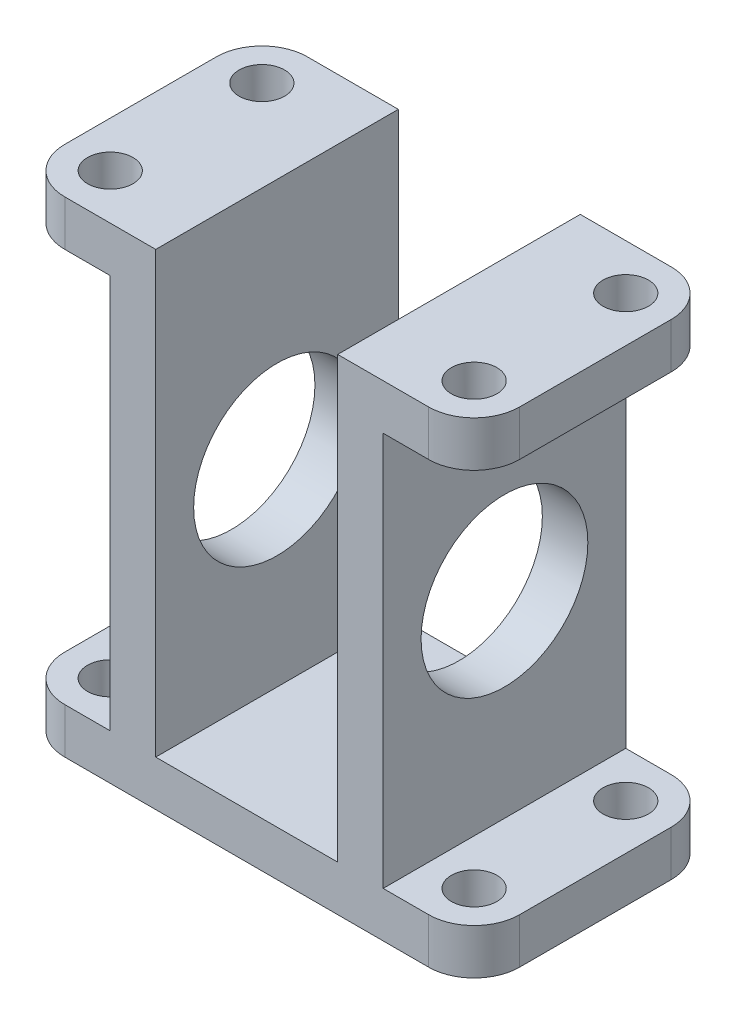
ISO-10303-21;
HEADER;
FILE_DESCRIPTION(('STEP AP214'),'2;1');
FILE_NAME('part.step','',(''),(''),'','','');
FILE_SCHEMA(('AUTOMOTIVE_DESIGN { 1 0 10303 214 1 1 1 1 }'));
ENDSEC;
DATA;
#1=APPLICATION_CONTEXT('core data for automotive mechanical design processes');
#2=APPLICATION_PROTOCOL_DEFINITION('international standard','automotive_design',2000,#1);
#3=PRODUCT_CONTEXT('',#1,'mechanical');
#4=PRODUCT('Part','Part','',(#3));
#5=PRODUCT_RELATED_PRODUCT_CATEGORY('part','',(#4));
#6=PRODUCT_DEFINITION_FORMATION('','',#4);
#7=PRODUCT_DEFINITION_CONTEXT('part definition',#1,'design');
#8=PRODUCT_DEFINITION('design','',#6,#7);
#9=PRODUCT_DEFINITION_SHAPE('','',#8);
#10=(LENGTH_UNIT() NAMED_UNIT(*) SI_UNIT(.MILLI.,.METRE.));
#11=(NAMED_UNIT(*) PLANE_ANGLE_UNIT() SI_UNIT($,.RADIAN.));
#12=(NAMED_UNIT(*) SI_UNIT($,.STERADIAN.) SOLID_ANGLE_UNIT());
#13=UNCERTAINTY_MEASURE_WITH_UNIT(LENGTH_MEASURE(1.E-05),#10,'distance_accuracy_value','');
#14=(GEOMETRIC_REPRESENTATION_CONTEXT(3) GLOBAL_UNCERTAINTY_ASSIGNED_CONTEXT((#13)) GLOBAL_UNIT_ASSIGNED_CONTEXT((#10,
#11,#12)) REPRESENTATION_CONTEXT('',''));
#15=CARTESIAN_POINT('',(0.,0.,0.));
#16=DIRECTION('',(0.,0.,1.));
#17=DIRECTION('',(1.,0.,0.));
#18=AXIS2_PLACEMENT_3D('',#15,#16,#17);
#19=CARTESIAN_POINT('',(9.00000000000002,32.,-8.));
#20=DIRECTION('',(-1.,0.,0.));
#21=DIRECTION('',(0.,0.,1.));
#22=AXIS2_PLACEMENT_3D('',#19,#20,#21);
#23=PLANE('',#22);
#24=CARTESIAN_POINT('',(9.00000000000002,16.,0.));
#25=DIRECTION('',(1.,0.,0.));
#26=DIRECTION('',(0.,0.,-1.));
#27=AXIS2_PLACEMENT_3D('',#24,#25,#26);
#28=CIRCLE('',#27,5.5);
#29=CARTESIAN_POINT('',(9.00000000000002,16.,-5.5));
#30=VERTEX_POINT('',#29);
#31=EDGE_CURVE('E291',#30,#30,#28,.T.);
#32=ORIENTED_EDGE('',*,*,#31,.F.);
#33=EDGE_LOOP('',(#32));
#34=FACE_BOUND('',#33,.T.);
#35=DIRECTION('',(0.,0.,-1.));
#36=VECTOR('',#35,1.);
#37=CARTESIAN_POINT('',(9.00000000000002,29.,8.));
#38=LINE('',#37,#36);
#39=CARTESIAN_POINT('',(9.00000000000002,29.,8.));
#40=VERTEX_POINT('',#39);
#41=CARTESIAN_POINT('',(9.00000000000002,29.,-8.));
#42=VERTEX_POINT('',#41);
#43=EDGE_CURVE('E201',#40,#42,#38,.T.);
#44=ORIENTED_EDGE('',*,*,#43,.F.);
#45=DIRECTION('',(0.,-1.,0.));
#46=VECTOR('',#45,1.);
#47=CARTESIAN_POINT('',(9.00000000000002,32.,8.));
#48=LINE('',#47,#46);
#49=CARTESIAN_POINT('',(9.00000000000002,3.,8.));
#50=VERTEX_POINT('',#49);
#51=EDGE_CURVE('E212',#40,#50,#48,.T.);
#52=ORIENTED_EDGE('',*,*,#51,.T.);
#53=DIRECTION('',(0.,0.,-1.));
#54=VECTOR('',#53,1.);
#55=CARTESIAN_POINT('',(9.00000000000002,3.,-8.));
#56=LINE('',#55,#54);
#57=CARTESIAN_POINT('',(9.00000000000002,3.,-8.));
#58=VERTEX_POINT('',#57);
#59=EDGE_CURVE('E440',#50,#58,#56,.T.);
#60=ORIENTED_EDGE('',*,*,#59,.T.);
#61=DIRECTION('',(0.,-1.,0.));
#62=VECTOR('',#61,1.);
#63=CARTESIAN_POINT('',(9.00000000000002,32.,-8.));
#64=LINE('',#63,#62);
#65=EDGE_CURVE('E215',#42,#58,#64,.T.);
#66=ORIENTED_EDGE('',*,*,#65,.F.);
#67=EDGE_LOOP('',(#44,#52,#60,#66));
#68=FACE_BOUND('',#67,.T.);
#69=ADVANCED_FACE('F35',(#34,#68),#23,.F.);
#70=CARTESIAN_POINT('',(-9.,32.,-8.));
#71=DIRECTION('',(1.,0.,0.));
#72=DIRECTION('',(0.,0.,-1.));
#73=AXIS2_PLACEMENT_3D('',#70,#71,#72);
#74=PLANE('',#73);
#75=CARTESIAN_POINT('',(-9.,16.,0.));
#76=DIRECTION('',(1.,0.,0.));
#77=DIRECTION('',(0.,0.,-1.));
#78=AXIS2_PLACEMENT_3D('',#75,#76,#77);
#79=CIRCLE('',#78,5.5);
#80=CARTESIAN_POINT('',(-9.,16.,-5.5));
#81=VERTEX_POINT('',#80);
#82=EDGE_CURVE('E217',#81,#81,#79,.T.);
#83=ORIENTED_EDGE('',*,*,#82,.T.);
#84=EDGE_LOOP('',(#83));
#85=FACE_BOUND('',#84,.T.);
#86=DIRECTION('',(0.,0.,1.));
#87=VECTOR('',#86,1.);
#88=CARTESIAN_POINT('',(-9.,29.,-8.));
#89=LINE('',#88,#87);
#90=CARTESIAN_POINT('',(-9.,29.,-8.));
#91=VERTEX_POINT('',#90);
#92=CARTESIAN_POINT('',(-9.,29.,8.));
#93=VERTEX_POINT('',#92);
#94=EDGE_CURVE('E207',#91,#93,#89,.T.);
#95=ORIENTED_EDGE('',*,*,#94,.F.);
#96=DIRECTION('',(0.,-1.,0.));
#97=VECTOR('',#96,1.);
#98=CARTESIAN_POINT('',(-9.,32.,-8.));
#99=LINE('',#98,#97);
#100=CARTESIAN_POINT('',(-9.,3.,-8.));
#101=VERTEX_POINT('',#100);
#102=EDGE_CURVE('E249',#91,#101,#99,.T.);
#103=ORIENTED_EDGE('',*,*,#102,.T.);
#104=DIRECTION('',(0.,0.,1.));
#105=VECTOR('',#104,1.);
#106=CARTESIAN_POINT('',(-9.,3.,-8.));
#107=LINE('',#106,#105);
#108=CARTESIAN_POINT('',(-9.,3.,8.));
#109=VERTEX_POINT('',#108);
#110=EDGE_CURVE('E240',#101,#109,#107,.T.);
#111=ORIENTED_EDGE('',*,*,#110,.T.);
#112=DIRECTION('',(0.,-1.,0.));
#113=VECTOR('',#112,1.);
#114=CARTESIAN_POINT('',(-9.,32.,8.));
#115=LINE('',#114,#113);
#116=EDGE_CURVE('E261',#93,#109,#115,.T.);
#117=ORIENTED_EDGE('',*,*,#116,.F.);
#118=EDGE_LOOP('',(#95,#103,#111,#117));
#119=FACE_BOUND('',#118,.T.);
#120=ADVANCED_FACE('F481',(#85,#119),#74,.F.);
#121=CARTESIAN_POINT('',(0.,3.,0.));
#122=DIRECTION('',(0.,-1.,0.));
#123=DIRECTION('',(0.,0.,-1.));
#124=AXIS2_PLACEMENT_3D('',#121,#122,#123);
#125=PLANE('',#124);
#126=CARTESIAN_POINT('',(12.,3.,5.));
#127=DIRECTION('',(0.,-1.,0.));
#128=DIRECTION('',(0.,0.,-1.));
#129=AXIS2_PLACEMENT_3D('',#126,#127,#128);
#130=CIRCLE('',#129,1.5);
#131=CARTESIAN_POINT('',(12.,3.,3.5));
#132=VERTEX_POINT('',#131);
#133=EDGE_CURVE('E300',#132,#132,#130,.T.);
#134=ORIENTED_EDGE('',*,*,#133,.T.);
#135=EDGE_LOOP('',(#134));
#136=FACE_BOUND('',#135,.T.);
#137=CARTESIAN_POINT('',(12.,3.,-5.));
#138=DIRECTION('',(0.,-1.,0.));
#139=DIRECTION('',(0.,0.,-1.));
#140=AXIS2_PLACEMENT_3D('',#137,#138,#139);
#141=CIRCLE('',#140,1.5);
#142=CARTESIAN_POINT('',(12.,3.,-6.5));
#143=VERTEX_POINT('',#142);
#144=EDGE_CURVE('E295',#143,#143,#141,.T.);
#145=ORIENTED_EDGE('',*,*,#144,.T.);
#146=EDGE_LOOP('',(#145));
#147=FACE_BOUND('',#146,.T.);
#148=DIRECTION('',(0.,0.,-1.));
#149=VECTOR('',#148,1.);
#150=CARTESIAN_POINT('',(15.,3.,8.));
#151=LINE('',#150,#149);
#152=CARTESIAN_POINT('',(15.,3.,5.));
#153=VERTEX_POINT('',#152);
#154=CARTESIAN_POINT('',(15.,3.,-5.));
#155=VERTEX_POINT('',#154);
#156=EDGE_CURVE('E265',#153,#155,#151,.T.);
#157=ORIENTED_EDGE('',*,*,#156,.T.);
#158=CARTESIAN_POINT('',(12.,3.,-5.));
#159=DIRECTION('',(0.,-1.,0.));
#160=DIRECTION('',(0.,0.,-1.));
#161=AXIS2_PLACEMENT_3D('',#158,#159,#160);
#162=CIRCLE('',#161,3.);
#163=CARTESIAN_POINT('',(12.,3.,-8.));
#164=VERTEX_POINT('',#163);
#165=EDGE_CURVE('E332',#155,#164,#162,.F.);
#166=ORIENTED_EDGE('',*,*,#165,.T.);
#167=DIRECTION('',(-1.,0.,0.));
#168=VECTOR('',#167,1.);
#169=CARTESIAN_POINT('',(-15.,3.,-8.));
#170=LINE('',#169,#168);
#171=EDGE_CURVE('E270',#164,#58,#170,.T.);
#172=ORIENTED_EDGE('',*,*,#171,.T.);
#173=ORIENTED_EDGE('',*,*,#59,.F.);
#174=DIRECTION('',(1.,0.,0.));
#175=VECTOR('',#174,1.);
#176=CARTESIAN_POINT('',(-15.,3.,8.));
#177=LINE('',#176,#175);
#178=CARTESIAN_POINT('',(12.,3.,8.));
#179=VERTEX_POINT('',#178);
#180=EDGE_CURVE('E222',#50,#179,#177,.T.);
#181=ORIENTED_EDGE('',*,*,#180,.T.);
#182=CARTESIAN_POINT('',(12.,3.,5.));
#183=DIRECTION('',(0.,-1.,0.));
#184=DIRECTION('',(0.,0.,-1.));
#185=AXIS2_PLACEMENT_3D('',#182,#183,#184);
#186=CIRCLE('',#185,3.);
#187=EDGE_CURVE('E330',#179,#153,#186,.F.);
#188=ORIENTED_EDGE('',*,*,#187,.T.);
#189=EDGE_LOOP('',(#157,#166,#172,#173,#181,#188));
#190=FACE_BOUND('',#189,.T.);
#191=ADVANCED_FACE('F487',(#136,#147,#190),#125,.F.);
#192=DIRECTION('',(0.,0.,1.));
#193=VECTOR('',#192,1.);
#194=CARTESIAN_POINT('',(6.00000000000002,3.,-8.));
#195=LINE('',#194,#193);
#196=CARTESIAN_POINT('',(6.00000000000002,3.,-8.));
#197=VERTEX_POINT('',#196);
#198=CARTESIAN_POINT('',(6.00000000000002,3.,8.));
#199=VERTEX_POINT('',#198);
#200=EDGE_CURVE('E234',#197,#199,#195,.T.);
#201=ORIENTED_EDGE('',*,*,#200,.F.);
#202=CARTESIAN_POINT('',(-6.,3.,-8.));
#203=VERTEX_POINT('',#202);
#204=EDGE_CURVE('E273',#197,#203,#170,.T.);
#205=ORIENTED_EDGE('',*,*,#204,.T.);
#206=DIRECTION('',(0.,0.,-1.));
#207=VECTOR('',#206,1.);
#208=CARTESIAN_POINT('',(-6.,3.,-8.));
#209=LINE('',#208,#207);
#210=CARTESIAN_POINT('',(-6.,3.,8.));
#211=VERTEX_POINT('',#210);
#212=EDGE_CURVE('E244',#211,#203,#209,.T.);
#213=ORIENTED_EDGE('',*,*,#212,.F.);
#214=EDGE_CURVE('E278',#211,#199,#177,.T.);
#215=ORIENTED_EDGE('',*,*,#214,.T.);
#216=EDGE_LOOP('',(#201,#205,#213,#215));
#217=FACE_BOUND('',#216,.T.);
#218=ADVANCED_FACE('F400',(#217),#125,.F.);
#219=CARTESIAN_POINT('',(-12.,3.,-5.));
#220=DIRECTION('',(0.,-1.,0.));
#221=DIRECTION('',(0.,0.,-1.));
#222=AXIS2_PLACEMENT_3D('',#219,#220,#221);
#223=CIRCLE('',#222,1.5);
#224=CARTESIAN_POINT('',(-12.,3.,-6.5));
#225=VERTEX_POINT('',#224);
#226=EDGE_CURVE('E308',#225,#225,#223,.T.);
#227=ORIENTED_EDGE('',*,*,#226,.T.);
#228=EDGE_LOOP('',(#227));
#229=FACE_BOUND('',#228,.T.);
#230=CARTESIAN_POINT('',(-12.,3.,5.));
#231=DIRECTION('',(0.,-1.,0.));
#232=DIRECTION('',(0.,0.,-1.));
#233=AXIS2_PLACEMENT_3D('',#230,#231,#232);
#234=CIRCLE('',#233,1.5);
#235=CARTESIAN_POINT('',(-12.,3.,3.5));
#236=VERTEX_POINT('',#235);
#237=EDGE_CURVE('E304',#236,#236,#234,.T.);
#238=ORIENTED_EDGE('',*,*,#237,.T.);
#239=EDGE_LOOP('',(#238));
#240=FACE_BOUND('',#239,.T.);
#241=DIRECTION('',(0.,0.,1.));
#242=VECTOR('',#241,1.);
#243=CARTESIAN_POINT('',(-15.,3.,8.));
#244=LINE('',#243,#242);
#245=CARTESIAN_POINT('',(-15.,3.,-5.));
#246=VERTEX_POINT('',#245);
#247=CARTESIAN_POINT('',(-15.,3.,5.));
#248=VERTEX_POINT('',#247);
#249=EDGE_CURVE('E272',#246,#248,#244,.T.);
#250=ORIENTED_EDGE('',*,*,#249,.T.);
#251=CARTESIAN_POINT('',(-12.,3.,5.));
#252=DIRECTION('',(0.,-1.,0.));
#253=DIRECTION('',(0.,0.,-1.));
#254=AXIS2_PLACEMENT_3D('',#251,#252,#253);
#255=CIRCLE('',#254,3.);
#256=CARTESIAN_POINT('',(-12.,3.,8.));
#257=VERTEX_POINT('',#256);
#258=EDGE_CURVE('E11',#248,#257,#255,.F.);
#259=ORIENTED_EDGE('',*,*,#258,.T.);
#260=EDGE_CURVE('E275',#257,#109,#177,.T.);
#261=ORIENTED_EDGE('',*,*,#260,.T.);
#262=ORIENTED_EDGE('',*,*,#110,.F.);
#263=CARTESIAN_POINT('',(-12.,3.,-8.));
#264=VERTEX_POINT('',#263);
#265=EDGE_CURVE('E268',#101,#264,#170,.T.);
#266=ORIENTED_EDGE('',*,*,#265,.T.);
#267=CARTESIAN_POINT('',(-12.,3.,-5.));
#268=DIRECTION('',(0.,-1.,0.));
#269=DIRECTION('',(0.,0.,-1.));
#270=AXIS2_PLACEMENT_3D('',#267,#268,#269);
#271=CIRCLE('',#270,3.);
#272=EDGE_CURVE('E43',#264,#246,#271,.F.);
#273=ORIENTED_EDGE('',*,*,#272,.T.);
#274=EDGE_LOOP('',(#250,#259,#261,#262,#266,#273));
#275=FACE_BOUND('',#274,.T.);
#276=ADVANCED_FACE('F389',(#229,#240,#275),#125,.F.);
#277=CARTESIAN_POINT('',(15.,3.,8.));
#278=DIRECTION('',(-1.,0.,0.));
#279=DIRECTION('',(0.,0.,1.));
#280=AXIS2_PLACEMENT_3D('',#277,#278,#279);
#281=PLANE('',#280);
#282=DIRECTION('',(0.,0.,-1.));
#283=VECTOR('',#282,1.);
#284=CARTESIAN_POINT('',(15.,0.,8.));
#285=LINE('',#284,#283);
#286=CARTESIAN_POINT('',(15.,0.,5.));
#287=VERTEX_POINT('',#286);
#288=CARTESIAN_POINT('',(15.,0.,-5.));
#289=VERTEX_POINT('',#288);
#290=EDGE_CURVE('E264',#287,#289,#285,.T.);
#291=ORIENTED_EDGE('',*,*,#290,.T.);
#292=DIRECTION('',(0.,-1.,0.));
#293=VECTOR('',#292,1.);
#294=CARTESIAN_POINT('',(15.,3.,-5.));
#295=LINE('',#294,#293);
#296=EDGE_CURVE('E328',#289,#155,#295,.F.);
#297=ORIENTED_EDGE('',*,*,#296,.T.);
#298=ORIENTED_EDGE('',*,*,#156,.F.);
#299=DIRECTION('',(0.,-1.,0.));
#300=VECTOR('',#299,1.);
#301=CARTESIAN_POINT('',(15.,3.,5.));
#302=LINE('',#301,#300);
#303=EDGE_CURVE('E325',#153,#287,#302,.T.);
#304=ORIENTED_EDGE('',*,*,#303,.T.);
#305=EDGE_LOOP('',(#291,#297,#298,#304));
#306=FACE_BOUND('',#305,.T.);
#307=ADVANCED_FACE('F502',(#306),#281,.F.);
#308=CARTESIAN_POINT('',(-15.,3.,-8.));
#309=DIRECTION('',(0.,0.,1.));
#310=DIRECTION('',(1.,0.,0.));
#311=AXIS2_PLACEMENT_3D('',#308,#309,#310);
#312=PLANE('',#311);
#313=ORIENTED_EDGE('',*,*,#171,.F.);
#314=DIRECTION('',(0.,-1.,0.));
#315=VECTOR('',#314,1.);
#316=CARTESIAN_POINT('',(12.,3.,-8.));
#317=LINE('',#316,#315);
#318=CARTESIAN_POINT('',(12.,0.,-8.));
#319=VERTEX_POINT('',#318);
#320=EDGE_CURVE('E314',#164,#319,#317,.T.);
#321=ORIENTED_EDGE('',*,*,#320,.T.);
#322=DIRECTION('',(-1.,0.,0.));
#323=VECTOR('',#322,1.);
#324=CARTESIAN_POINT('',(-15.,0.,-8.));
#325=LINE('',#324,#323);
#326=CARTESIAN_POINT('',(-12.,0.,-8.));
#327=VERTEX_POINT('',#326);
#328=EDGE_CURVE('E281',#319,#327,#325,.T.);
#329=ORIENTED_EDGE('',*,*,#328,.T.);
#330=DIRECTION('',(0.,-1.,0.));
#331=VECTOR('',#330,1.);
#332=CARTESIAN_POINT('',(-12.,3.,-8.));
#333=LINE('',#332,#331);
#334=EDGE_CURVE('E277',#327,#264,#333,.F.);
#335=ORIENTED_EDGE('',*,*,#334,.T.);
#336=ORIENTED_EDGE('',*,*,#265,.F.);
#337=ORIENTED_EDGE('',*,*,#102,.F.);
#338=DIRECTION('',(1.,0.,0.));
#339=VECTOR('',#338,1.);
#340=CARTESIAN_POINT('',(-15.,29.,-8.));
#341=LINE('',#340,#339);
#342=CARTESIAN_POINT('',(-12.,29.,-8.));
#343=VERTEX_POINT('',#342);
#344=EDGE_CURVE('E438',#343,#91,#341,.T.);
#345=ORIENTED_EDGE('',*,*,#344,.F.);
#346=DIRECTION('',(0.,-1.,0.));
#347=VECTOR('',#346,1.);
#348=CARTESIAN_POINT('',(-12.,32.,-8.));
#349=LINE('',#348,#347);
#350=CARTESIAN_POINT('',(-12.,32.,-8.));
#351=VERTEX_POINT('',#350);
#352=EDGE_CURVE('E310',#343,#351,#349,.F.);
#353=ORIENTED_EDGE('',*,*,#352,.T.);
#354=DIRECTION('',(-1.,0.,0.));
#355=VECTOR('',#354,1.);
#356=CARTESIAN_POINT('',(-9.,32.,-8.));
#357=LINE('',#356,#355);
#358=CARTESIAN_POINT('',(-6.,32.,-8.));
#359=VERTEX_POINT('',#358);
#360=EDGE_CURVE('E246',#359,#351,#357,.T.);
#361=ORIENTED_EDGE('',*,*,#360,.F.);
#362=DIRECTION('',(0.,-1.,0.));
#363=VECTOR('',#362,1.);
#364=CARTESIAN_POINT('',(-6.,32.,-8.));
#365=LINE('',#364,#363);
#366=EDGE_CURVE('E255',#359,#203,#365,.T.);
#367=ORIENTED_EDGE('',*,*,#366,.T.);
#368=ORIENTED_EDGE('',*,*,#204,.F.);
#369=DIRECTION('',(0.,-1.,0.));
#370=VECTOR('',#369,1.);
#371=CARTESIAN_POINT('',(6.00000000000002,32.,-8.));
#372=LINE('',#371,#370);
#373=CARTESIAN_POINT('',(6.00000000000002,32.,-8.));
#374=VERTEX_POINT('',#373);
#375=EDGE_CURVE('E228',#374,#197,#372,.T.);
#376=ORIENTED_EDGE('',*,*,#375,.F.);
#377=DIRECTION('',(-1.,0.,0.));
#378=VECTOR('',#377,1.);
#379=CARTESIAN_POINT('',(9.00000000000002,32.,-8.));
#380=LINE('',#379,#378);
#381=CARTESIAN_POINT('',(12.,32.,-8.));
#382=VERTEX_POINT('',#381);
#383=EDGE_CURVE('E441',#382,#374,#380,.T.);
#384=ORIENTED_EDGE('',*,*,#383,.F.);
#385=DIRECTION('',(0.,1.,0.));
#386=VECTOR('',#385,1.);
#387=CARTESIAN_POINT('',(12.,29.,-8.));
#388=LINE('',#387,#386);
#389=CARTESIAN_POINT('',(12.,29.,-8.));
#390=VERTEX_POINT('',#389);
#391=EDGE_CURVE('E312',#382,#390,#388,.F.);
#392=ORIENTED_EDGE('',*,*,#391,.T.);
#393=DIRECTION('',(-1.,0.,0.));
#394=VECTOR('',#393,1.);
#395=CARTESIAN_POINT('',(15.,29.,-8.));
#396=LINE('',#395,#394);
#397=EDGE_CURVE('E208',#390,#42,#396,.T.);
#398=ORIENTED_EDGE('',*,*,#397,.T.);
#399=ORIENTED_EDGE('',*,*,#65,.T.);
#400=EDGE_LOOP('',(#313,#321,#329,#335,#336,#337,#345,#353,#361,#367,#368,#376,#384,#392,#398,#399));
#401=FACE_BOUND('',#400,.T.);
#402=ADVANCED_FACE('F395',(#401),#312,.F.);
#403=CARTESIAN_POINT('',(-15.,3.,8.));
#404=DIRECTION('',(1.,0.,0.));
#405=DIRECTION('',(0.,0.,-1.));
#406=AXIS2_PLACEMENT_3D('',#403,#404,#405);
#407=PLANE('',#406);
#408=DIRECTION('',(0.,0.,1.));
#409=VECTOR('',#408,1.);
#410=CARTESIAN_POINT('',(-15.,0.,8.));
#411=LINE('',#410,#409);
#412=CARTESIAN_POINT('',(-15.,0.,-5.));
#413=VERTEX_POINT('',#412);
#414=CARTESIAN_POINT('',(-15.,0.,5.));
#415=VERTEX_POINT('',#414);
#416=EDGE_CURVE('E284',#413,#415,#411,.T.);
#417=ORIENTED_EDGE('',*,*,#416,.T.);
#418=DIRECTION('',(0.,-1.,0.));
#419=VECTOR('',#418,1.);
#420=CARTESIAN_POINT('',(-15.,3.,5.));
#421=LINE('',#420,#419);
#422=EDGE_CURVE('E50',#415,#248,#421,.F.);
#423=ORIENTED_EDGE('',*,*,#422,.T.);
#424=ORIENTED_EDGE('',*,*,#249,.F.);
#425=DIRECTION('',(0.,-1.,0.));
#426=VECTOR('',#425,1.);
#427=CARTESIAN_POINT('',(-15.,3.,-5.));
#428=LINE('',#427,#426);
#429=EDGE_CURVE('E370',#246,#413,#428,.T.);
#430=ORIENTED_EDGE('',*,*,#429,.T.);
#431=EDGE_LOOP('',(#417,#423,#424,#430));
#432=FACE_BOUND('',#431,.T.);
#433=ADVANCED_FACE('F375',(#432),#407,.F.);
#434=CARTESIAN_POINT('',(-15.,3.,8.));
#435=DIRECTION('',(0.,0.,-1.));
#436=DIRECTION('',(-1.,0.,0.));
#437=AXIS2_PLACEMENT_3D('',#434,#435,#436);
#438=PLANE('',#437);
#439=DIRECTION('',(1.,0.,0.));
#440=VECTOR('',#439,1.);
#441=CARTESIAN_POINT('',(-15.,0.,8.));
#442=LINE('',#441,#440);
#443=CARTESIAN_POINT('',(-12.,0.,8.));
#444=VERTEX_POINT('',#443);
#445=CARTESIAN_POINT('',(12.,0.,8.));
#446=VERTEX_POINT('',#445);
#447=EDGE_CURVE('E269',#444,#446,#442,.T.);
#448=ORIENTED_EDGE('',*,*,#447,.T.);
#449=DIRECTION('',(0.,-1.,0.));
#450=VECTOR('',#449,1.);
#451=CARTESIAN_POINT('',(12.,3.,8.));
#452=LINE('',#451,#450);
#453=EDGE_CURVE('E341',#446,#179,#452,.F.);
#454=ORIENTED_EDGE('',*,*,#453,.T.);
#455=ORIENTED_EDGE('',*,*,#180,.F.);
#456=ORIENTED_EDGE('',*,*,#51,.F.);
#457=DIRECTION('',(-1.,0.,0.));
#458=VECTOR('',#457,1.);
#459=CARTESIAN_POINT('',(15.,29.,8.));
#460=LINE('',#459,#458);
#461=CARTESIAN_POINT('',(12.,29.,8.));
#462=VERTEX_POINT('',#461);
#463=EDGE_CURVE('E196',#462,#40,#460,.T.);
#464=ORIENTED_EDGE('',*,*,#463,.F.);
#465=DIRECTION('',(0.,-1.,0.));
#466=VECTOR('',#465,1.);
#467=CARTESIAN_POINT('',(12.,32.,8.));
#468=LINE('',#467,#466);
#469=CARTESIAN_POINT('',(12.,32.,8.));
#470=VERTEX_POINT('',#469);
#471=EDGE_CURVE('E339',#462,#470,#468,.F.);
#472=ORIENTED_EDGE('',*,*,#471,.T.);
#473=DIRECTION('',(1.,0.,0.));
#474=VECTOR('',#473,1.);
#475=CARTESIAN_POINT('',(9.00000000000002,32.,8.));
#476=LINE('',#475,#474);
#477=CARTESIAN_POINT('',(6.00000000000002,32.,8.));
#478=VERTEX_POINT('',#477);
#479=EDGE_CURVE('E225',#478,#470,#476,.T.);
#480=ORIENTED_EDGE('',*,*,#479,.F.);
#481=DIRECTION('',(0.,-1.,0.));
#482=VECTOR('',#481,1.);
#483=CARTESIAN_POINT('',(6.00000000000002,32.,8.));
#484=LINE('',#483,#482);
#485=EDGE_CURVE('E224',#478,#199,#484,.T.);
#486=ORIENTED_EDGE('',*,*,#485,.T.);
#487=ORIENTED_EDGE('',*,*,#214,.F.);
#488=DIRECTION('',(0.,-1.,0.));
#489=VECTOR('',#488,1.);
#490=CARTESIAN_POINT('',(-6.,32.,8.));
#491=LINE('',#490,#489);
#492=CARTESIAN_POINT('',(-6.,32.,8.));
#493=VERTEX_POINT('',#492);
#494=EDGE_CURVE('E258',#493,#211,#491,.T.);
#495=ORIENTED_EDGE('',*,*,#494,.F.);
#496=DIRECTION('',(1.,0.,0.));
#497=VECTOR('',#496,1.);
#498=CARTESIAN_POINT('',(-9.,32.,8.));
#499=LINE('',#498,#497);
#500=CARTESIAN_POINT('',(-12.,32.,8.));
#501=VERTEX_POINT('',#500);
#502=EDGE_CURVE('E241',#501,#493,#499,.T.);
#503=ORIENTED_EDGE('',*,*,#502,.F.);
#504=DIRECTION('',(0.,1.,0.));
#505=VECTOR('',#504,1.);
#506=CARTESIAN_POINT('',(-12.,29.,8.));
#507=LINE('',#506,#505);
#508=CARTESIAN_POINT('',(-12.,29.,8.));
#509=VERTEX_POINT('',#508);
#510=EDGE_CURVE('E337',#501,#509,#507,.F.);
#511=ORIENTED_EDGE('',*,*,#510,.T.);
#512=DIRECTION('',(1.,0.,0.));
#513=VECTOR('',#512,1.);
#514=CARTESIAN_POINT('',(-15.,29.,8.));
#515=LINE('',#514,#513);
#516=EDGE_CURVE('E431',#509,#93,#515,.T.);
#517=ORIENTED_EDGE('',*,*,#516,.T.);
#518=ORIENTED_EDGE('',*,*,#116,.T.);
#519=ORIENTED_EDGE('',*,*,#260,.F.);
#520=DIRECTION('',(0.,-1.,0.));
#521=VECTOR('',#520,1.);
#522=CARTESIAN_POINT('',(-12.,3.,8.));
#523=LINE('',#522,#521);
#524=EDGE_CURVE('E334',#257,#444,#523,.T.);
#525=ORIENTED_EDGE('',*,*,#524,.T.);
#526=EDGE_LOOP('',(#448,#454,#455,#456,#464,#472,#480,#486,#487,#495,#503,#511,#517,#518,#519,#525));
#527=FACE_BOUND('',#526,.T.);
#528=ADVANCED_FACE('F220',(#527),#438,.F.);
#529=CARTESIAN_POINT('',(0.,0.,0.));
#530=DIRECTION('',(0.,-1.,0.));
#531=DIRECTION('',(0.,0.,-1.));
#532=AXIS2_PLACEMENT_3D('',#529,#530,#531);
#533=PLANE('',#532);
#534=CARTESIAN_POINT('',(-12.,0.,-5.));
#535=DIRECTION('',(0.,1.,0.));
#536=DIRECTION('',(0.,0.,-1.));
#537=AXIS2_PLACEMENT_3D('',#534,#535,#536);
#538=CIRCLE('',#537,1.5);
#539=CARTESIAN_POINT('',(-12.,0.,-6.5));
#540=VERTEX_POINT('',#539);
#541=EDGE_CURVE('E849',#540,#540,#538,.T.);
#542=ORIENTED_EDGE('',*,*,#541,.T.);
#543=EDGE_LOOP('',(#542));
#544=FACE_BOUND('',#543,.T.);
#545=CARTESIAN_POINT('',(-12.,0.,5.));
#546=DIRECTION('',(0.,1.,0.));
#547=DIRECTION('',(0.,0.,1.));
#548=AXIS2_PLACEMENT_3D('',#545,#546,#547);
#549=CIRCLE('',#548,1.5);
#550=CARTESIAN_POINT('',(-12.,0.,6.5));
#551=VERTEX_POINT('',#550);
#552=EDGE_CURVE('E855',#551,#551,#549,.T.);
#553=ORIENTED_EDGE('',*,*,#552,.T.);
#554=EDGE_LOOP('',(#553));
#555=FACE_BOUND('',#554,.T.);
#556=CARTESIAN_POINT('',(12.,0.,5.));
#557=DIRECTION('',(0.,1.,0.));
#558=DIRECTION('',(0.,0.,-1.));
#559=AXIS2_PLACEMENT_3D('',#556,#557,#558);
#560=CIRCLE('',#559,1.5);
#561=CARTESIAN_POINT('',(12.,0.,3.5));
#562=VERTEX_POINT('',#561);
#563=EDGE_CURVE('E843',#562,#562,#560,.T.);
#564=ORIENTED_EDGE('',*,*,#563,.T.);
#565=EDGE_LOOP('',(#564));
#566=FACE_BOUND('',#565,.T.);
#567=CARTESIAN_POINT('',(12.,0.,-5.));
#568=DIRECTION('',(0.,1.,0.));
#569=DIRECTION('',(0.,0.,1.));
#570=AXIS2_PLACEMENT_3D('',#567,#568,#569);
#571=CIRCLE('',#570,1.5);
#572=CARTESIAN_POINT('',(12.,0.,-3.5));
#573=VERTEX_POINT('',#572);
#574=EDGE_CURVE('E296',#573,#573,#571,.T.);
#575=ORIENTED_EDGE('',*,*,#574,.T.);
#576=EDGE_LOOP('',(#575));
#577=FACE_BOUND('',#576,.T.);
#578=ORIENTED_EDGE('',*,*,#328,.F.);
#579=CARTESIAN_POINT('',(12.,0.,-5.));
#580=DIRECTION('',(0.,-1.,0.));
#581=DIRECTION('',(0.,0.,-1.));
#582=AXIS2_PLACEMENT_3D('',#579,#580,#581);
#583=CIRCLE('',#582,3.);
#584=EDGE_CURVE('E323',#319,#289,#583,.T.);
#585=ORIENTED_EDGE('',*,*,#584,.T.);
#586=ORIENTED_EDGE('',*,*,#290,.F.);
#587=CARTESIAN_POINT('',(12.,0.,5.));
#588=DIRECTION('',(0.,-1.,0.));
#589=DIRECTION('',(0.,0.,-1.));
#590=AXIS2_PLACEMENT_3D('',#587,#588,#589);
#591=CIRCLE('',#590,3.);
#592=EDGE_CURVE('E321',#287,#446,#591,.T.);
#593=ORIENTED_EDGE('',*,*,#592,.T.);
#594=ORIENTED_EDGE('',*,*,#447,.F.);
#595=CARTESIAN_POINT('',(-12.,0.,5.));
#596=DIRECTION('',(0.,-1.,0.));
#597=DIRECTION('',(0.,0.,-1.));
#598=AXIS2_PLACEMENT_3D('',#595,#596,#597);
#599=CIRCLE('',#598,3.);
#600=EDGE_CURVE('E319',#444,#415,#599,.T.);
#601=ORIENTED_EDGE('',*,*,#600,.T.);
#602=ORIENTED_EDGE('',*,*,#416,.F.);
#603=CARTESIAN_POINT('',(-12.,0.,-5.));
#604=DIRECTION('',(0.,-1.,0.));
#605=DIRECTION('',(0.,0.,-1.));
#606=AXIS2_PLACEMENT_3D('',#603,#604,#605);
#607=CIRCLE('',#606,3.);
#608=EDGE_CURVE('E317',#413,#327,#607,.T.);
#609=ORIENTED_EDGE('',*,*,#608,.T.);
#610=EDGE_LOOP('',(#578,#585,#586,#593,#594,#601,#602,#609));
#611=FACE_BOUND('',#610,.T.);
#612=ADVANCED_FACE('F379',(#544,#555,#566,#577,#611),#533,.T.);
#613=CARTESIAN_POINT('',(-6.,32.,-8.));
#614=DIRECTION('',(-1.,0.,0.));
#615=DIRECTION('',(0.,0.,1.));
#616=AXIS2_PLACEMENT_3D('',#613,#614,#615);
#617=PLANE('',#616);
#618=CARTESIAN_POINT('',(-6.,16.,0.));
#619=DIRECTION('',(-1.,0.,0.));
#620=DIRECTION('',(0.,0.,1.));
#621=AXIS2_PLACEMENT_3D('',#618,#619,#620);
#622=CIRCLE('',#621,5.5);
#623=CARTESIAN_POINT('',(-6.,16.,-5.5));
#624=VERTEX_POINT('',#623);
#625=EDGE_CURVE('E290',#624,#624,#622,.T.);
#626=ORIENTED_EDGE('',*,*,#625,.T.);
#627=EDGE_LOOP('',(#626));
#628=FACE_BOUND('',#627,.T.);
#629=ORIENTED_EDGE('',*,*,#212,.T.);
#630=ORIENTED_EDGE('',*,*,#366,.F.);
#631=DIRECTION('',(0.,0.,-1.));
#632=VECTOR('',#631,1.);
#633=CARTESIAN_POINT('',(-6.,32.,-8.));
#634=LINE('',#633,#632);
#635=EDGE_CURVE('E243',#493,#359,#634,.T.);
#636=ORIENTED_EDGE('',*,*,#635,.F.);
#637=ORIENTED_EDGE('',*,*,#494,.T.);
#638=EDGE_LOOP('',(#629,#630,#636,#637));
#639=FACE_BOUND('',#638,.T.);
#640=ADVANCED_FACE('F406',(#628,#639),#617,.F.);
#641=CARTESIAN_POINT('',(0.,32.,0.));
#642=DIRECTION('',(0.,1.,0.));
#643=DIRECTION('',(0.,0.,1.));
#644=AXIS2_PLACEMENT_3D('',#641,#642,#643);
#645=PLANE('',#644);
#646=CARTESIAN_POINT('',(-12.,32.,-5.));
#647=DIRECTION('',(0.,1.,0.));
#648=DIRECTION('',(0.,0.,-1.));
#649=AXIS2_PLACEMENT_3D('',#646,#647,#648);
#650=CIRCLE('',#649,1.5);
#651=CARTESIAN_POINT('',(-12.,32.,-6.5));
#652=VERTEX_POINT('',#651);
#653=EDGE_CURVE('E846',#652,#652,#650,.T.);
#654=ORIENTED_EDGE('',*,*,#653,.F.);
#655=EDGE_LOOP('',(#654));
#656=FACE_BOUND('',#655,.T.);
#657=CARTESIAN_POINT('',(-12.,32.,5.));
#658=DIRECTION('',(0.,1.,0.));
#659=DIRECTION('',(0.,0.,1.));
#660=AXIS2_PLACEMENT_3D('',#657,#658,#659);
#661=CIRCLE('',#660,1.5);
#662=CARTESIAN_POINT('',(-12.,32.,6.5));
#663=VERTEX_POINT('',#662);
#664=EDGE_CURVE('E852',#663,#663,#661,.T.);
#665=ORIENTED_EDGE('',*,*,#664,.F.);
#666=EDGE_LOOP('',(#665));
#667=FACE_BOUND('',#666,.T.);
#668=ORIENTED_EDGE('',*,*,#360,.T.);
#669=CARTESIAN_POINT('',(-12.,32.,-5.));
#670=DIRECTION('',(0.,1.,0.));
#671=DIRECTION('',(0.,0.,1.));
#672=AXIS2_PLACEMENT_3D('',#669,#670,#671);
#673=CIRCLE('',#672,3.);
#674=CARTESIAN_POINT('',(-15.,32.,-5.));
#675=VERTEX_POINT('',#674);
#676=EDGE_CURVE('E368',#351,#675,#673,.T.);
#677=ORIENTED_EDGE('',*,*,#676,.T.);
#678=DIRECTION('',(0.,0.,-1.));
#679=VECTOR('',#678,1.);
#680=CARTESIAN_POINT('',(-15.,32.,-8.));
#681=LINE('',#680,#679);
#682=CARTESIAN_POINT('',(-15.,32.,5.));
#683=VERTEX_POINT('',#682);
#684=EDGE_CURVE('E425',#683,#675,#681,.T.);
#685=ORIENTED_EDGE('',*,*,#684,.F.);
#686=CARTESIAN_POINT('',(-12.,32.,5.));
#687=DIRECTION('',(0.,1.,0.));
#688=DIRECTION('',(0.,0.,1.));
#689=AXIS2_PLACEMENT_3D('',#686,#687,#688);
#690=CIRCLE('',#689,3.);
#691=EDGE_CURVE('E366',#683,#501,#690,.T.);
#692=ORIENTED_EDGE('',*,*,#691,.T.);
#693=ORIENTED_EDGE('',*,*,#502,.T.);
#694=ORIENTED_EDGE('',*,*,#635,.T.);
#695=EDGE_LOOP('',(#668,#677,#685,#692,#693,#694));
#696=FACE_BOUND('',#695,.T.);
#697=ADVANCED_FACE('F413',(#656,#667,#696),#645,.T.);
#698=CARTESIAN_POINT('',(6.00000000000002,32.,-8.));
#699=DIRECTION('',(1.,0.,0.));
#700=DIRECTION('',(0.,0.,-1.));
#701=AXIS2_PLACEMENT_3D('',#698,#699,#700);
#702=PLANE('',#701);
#703=CARTESIAN_POINT('',(6.00000000000002,16.,0.));
#704=DIRECTION('',(1.,0.,0.));
#705=DIRECTION('',(0.,0.,-1.));
#706=AXIS2_PLACEMENT_3D('',#703,#704,#705);
#707=CIRCLE('',#706,5.5);
#708=CARTESIAN_POINT('',(6.00000000000002,16.,-5.5));
#709=VERTEX_POINT('',#708);
#710=EDGE_CURVE('E287',#709,#709,#707,.T.);
#711=ORIENTED_EDGE('',*,*,#710,.T.);
#712=EDGE_LOOP('',(#711));
#713=FACE_BOUND('',#712,.T.);
#714=ORIENTED_EDGE('',*,*,#200,.T.);
#715=ORIENTED_EDGE('',*,*,#485,.F.);
#716=DIRECTION('',(0.,0.,1.));
#717=VECTOR('',#716,1.);
#718=CARTESIAN_POINT('',(6.00000000000002,32.,-8.));
#719=LINE('',#718,#717);
#720=EDGE_CURVE('E231',#374,#478,#719,.T.);
#721=ORIENTED_EDGE('',*,*,#720,.F.);
#722=ORIENTED_EDGE('',*,*,#375,.T.);
#723=EDGE_LOOP('',(#714,#715,#721,#722));
#724=FACE_BOUND('',#723,.T.);
#725=ADVANCED_FACE('F445',(#713,#724),#702,.F.);
#726=CARTESIAN_POINT('',(0.,32.,0.));
#727=DIRECTION('',(0.,-1.,0.));
#728=DIRECTION('',(0.,0.,-1.));
#729=AXIS2_PLACEMENT_3D('',#726,#727,#728);
#730=PLANE('',#729);
#731=CARTESIAN_POINT('',(12.,32.,5.));
#732=DIRECTION('',(0.,1.,0.));
#733=DIRECTION('',(0.,0.,-1.));
#734=AXIS2_PLACEMENT_3D('',#731,#732,#733);
#735=CIRCLE('',#734,1.5);
#736=CARTESIAN_POINT('',(12.,32.,3.5));
#737=VERTEX_POINT('',#736);
#738=EDGE_CURVE('E858',#737,#737,#735,.T.);
#739=ORIENTED_EDGE('',*,*,#738,.F.);
#740=EDGE_LOOP('',(#739));
#741=FACE_BOUND('',#740,.T.);
#742=CARTESIAN_POINT('',(12.,32.,-5.));
#743=DIRECTION('',(0.,1.,0.));
#744=DIRECTION('',(0.,0.,1.));
#745=AXIS2_PLACEMENT_3D('',#742,#743,#744);
#746=CIRCLE('',#745,1.5);
#747=CARTESIAN_POINT('',(12.,32.,-3.5));
#748=VERTEX_POINT('',#747);
#749=EDGE_CURVE('E840',#748,#748,#746,.T.);
#750=ORIENTED_EDGE('',*,*,#749,.F.);
#751=EDGE_LOOP('',(#750));
#752=FACE_BOUND('',#751,.T.);
#753=ORIENTED_EDGE('',*,*,#479,.T.);
#754=CARTESIAN_POINT('',(12.,32.,5.));
#755=DIRECTION('',(0.,-1.,0.));
#756=DIRECTION('',(0.,0.,-1.));
#757=AXIS2_PLACEMENT_3D('',#754,#755,#756);
#758=CIRCLE('',#757,3.);
#759=CARTESIAN_POINT('',(15.,32.,5.));
#760=VERTEX_POINT('',#759);
#761=EDGE_CURVE('E354',#470,#760,#758,.F.);
#762=ORIENTED_EDGE('',*,*,#761,.T.);
#763=DIRECTION('',(0.,0.,1.));
#764=VECTOR('',#763,1.);
#765=CARTESIAN_POINT('',(15.,32.,8.));
#766=LINE('',#765,#764);
#767=CARTESIAN_POINT('',(15.,32.,-5.));
#768=VERTEX_POINT('',#767);
#769=EDGE_CURVE('E460',#768,#760,#766,.T.);
#770=ORIENTED_EDGE('',*,*,#769,.F.);
#771=CARTESIAN_POINT('',(12.,32.,-5.));
#772=DIRECTION('',(0.,-1.,0.));
#773=DIRECTION('',(0.,0.,-1.));
#774=AXIS2_PLACEMENT_3D('',#771,#772,#773);
#775=CIRCLE('',#774,3.);
#776=EDGE_CURVE('E352',#768,#382,#775,.F.);
#777=ORIENTED_EDGE('',*,*,#776,.T.);
#778=ORIENTED_EDGE('',*,*,#383,.T.);
#779=ORIENTED_EDGE('',*,*,#720,.T.);
#780=EDGE_LOOP('',(#753,#762,#770,#777,#778,#779));
#781=FACE_BOUND('',#780,.T.);
#782=ADVANCED_FACE('F450',(#741,#752,#781),#730,.F.);
#783=CARTESIAN_POINT('',(-15.,29.,-8.));
#784=DIRECTION('',(0.,1.,0.));
#785=DIRECTION('',(0.,0.,1.));
#786=AXIS2_PLACEMENT_3D('',#783,#784,#785);
#787=PLANE('',#786);
#788=CARTESIAN_POINT('',(-12.,29.,-5.));
#789=DIRECTION('',(0.,1.,0.));
#790=DIRECTION('',(0.,0.,1.));
#791=AXIS2_PLACEMENT_3D('',#788,#789,#790);
#792=CIRCLE('',#791,1.5);
#793=CARTESIAN_POINT('',(-12.,29.,-3.5));
#794=VERTEX_POINT('',#793);
#795=EDGE_CURVE('E305',#794,#794,#792,.T.);
#796=ORIENTED_EDGE('',*,*,#795,.T.);
#797=EDGE_LOOP('',(#796));
#798=FACE_BOUND('',#797,.T.);
#799=CARTESIAN_POINT('',(-12.,29.,5.));
#800=DIRECTION('',(0.,1.,0.));
#801=DIRECTION('',(0.,0.,1.));
#802=AXIS2_PLACEMENT_3D('',#799,#800,#801);
#803=CIRCLE('',#802,1.5);
#804=CARTESIAN_POINT('',(-12.,29.,6.5));
#805=VERTEX_POINT('',#804);
#806=EDGE_CURVE('E301',#805,#805,#803,.T.);
#807=ORIENTED_EDGE('',*,*,#806,.T.);
#808=EDGE_LOOP('',(#807));
#809=FACE_BOUND('',#808,.T.);
#810=DIRECTION('',(0.,0.,1.));
#811=VECTOR('',#810,1.);
#812=CARTESIAN_POINT('',(-15.,29.,-8.));
#813=LINE('',#812,#811);
#814=CARTESIAN_POINT('',(-15.,29.,-5.));
#815=VERTEX_POINT('',#814);
#816=CARTESIAN_POINT('',(-15.,29.,5.));
#817=VERTEX_POINT('',#816);
#818=EDGE_CURVE('E423',#815,#817,#813,.T.);
#819=ORIENTED_EDGE('',*,*,#818,.F.);
#820=CARTESIAN_POINT('',(-12.,29.,-5.));
#821=DIRECTION('',(0.,1.,0.));
#822=DIRECTION('',(0.,0.,1.));
#823=AXIS2_PLACEMENT_3D('',#820,#821,#822);
#824=CIRCLE('',#823,3.);
#825=EDGE_CURVE('E364',#815,#343,#824,.F.);
#826=ORIENTED_EDGE('',*,*,#825,.T.);
#827=ORIENTED_EDGE('',*,*,#344,.T.);
#828=ORIENTED_EDGE('',*,*,#94,.T.);
#829=ORIENTED_EDGE('',*,*,#516,.F.);
#830=CARTESIAN_POINT('',(-12.,29.,5.));
#831=DIRECTION('',(0.,1.,0.));
#832=DIRECTION('',(0.,0.,1.));
#833=AXIS2_PLACEMENT_3D('',#830,#831,#832);
#834=CIRCLE('',#833,3.);
#835=EDGE_CURVE('E362',#509,#817,#834,.F.);
#836=ORIENTED_EDGE('',*,*,#835,.T.);
#837=EDGE_LOOP('',(#819,#826,#827,#828,#829,#836));
#838=FACE_BOUND('',#837,.T.);
#839=ADVANCED_FACE('F427',(#798,#809,#838),#787,.F.);
#840=CARTESIAN_POINT('',(-15.,0.,0.));
#841=DIRECTION('',(-1.,0.,0.));
#842=DIRECTION('',(0.,0.,1.));
#843=AXIS2_PLACEMENT_3D('',#840,#841,#842);
#844=PLANE('',#843);
#845=ORIENTED_EDGE('',*,*,#684,.T.);
#846=DIRECTION('',(0.,-1.,0.));
#847=VECTOR('',#846,1.);
#848=CARTESIAN_POINT('',(-15.,29.,-5.));
#849=LINE('',#848,#847);
#850=EDGE_CURVE('E359',#675,#815,#849,.T.);
#851=ORIENTED_EDGE('',*,*,#850,.T.);
#852=ORIENTED_EDGE('',*,*,#818,.T.);
#853=DIRECTION('',(0.,1.,0.));
#854=VECTOR('',#853,1.);
#855=CARTESIAN_POINT('',(-15.,32.,5.));
#856=LINE('',#855,#854);
#857=EDGE_CURVE('E356',#817,#683,#856,.T.);
#858=ORIENTED_EDGE('',*,*,#857,.T.);
#859=EDGE_LOOP('',(#845,#851,#852,#858));
#860=FACE_BOUND('',#859,.T.);
#861=ADVANCED_FACE('F422',(#860),#844,.T.);
#862=CARTESIAN_POINT('',(15.,29.,8.));
#863=DIRECTION('',(0.,1.,0.));
#864=DIRECTION('',(0.,0.,1.));
#865=AXIS2_PLACEMENT_3D('',#862,#863,#864);
#866=PLANE('',#865);
#867=CARTESIAN_POINT('',(12.,29.,5.));
#868=DIRECTION('',(0.,1.,0.));
#869=DIRECTION('',(0.,0.,1.));
#870=AXIS2_PLACEMENT_3D('',#867,#868,#869);
#871=CIRCLE('',#870,1.5);
#872=CARTESIAN_POINT('',(12.,29.,6.5));
#873=VERTEX_POINT('',#872);
#874=EDGE_CURVE('E297',#873,#873,#871,.T.);
#875=ORIENTED_EDGE('',*,*,#874,.T.);
#876=EDGE_LOOP('',(#875));
#877=FACE_BOUND('',#876,.T.);
#878=CARTESIAN_POINT('',(12.,29.,-5.));
#879=DIRECTION('',(0.,1.,0.));
#880=DIRECTION('',(0.,0.,1.));
#881=AXIS2_PLACEMENT_3D('',#878,#879,#880);
#882=CIRCLE('',#881,1.5);
#883=CARTESIAN_POINT('',(12.,29.,-3.5));
#884=VERTEX_POINT('',#883);
#885=EDGE_CURVE('E292',#884,#884,#882,.T.);
#886=ORIENTED_EDGE('',*,*,#885,.T.);
#887=EDGE_LOOP('',(#886));
#888=FACE_BOUND('',#887,.T.);
#889=DIRECTION('',(0.,0.,-1.));
#890=VECTOR('',#889,1.);
#891=CARTESIAN_POINT('',(15.,29.,8.));
#892=LINE('',#891,#890);
#893=CARTESIAN_POINT('',(15.,29.,5.));
#894=VERTEX_POINT('',#893);
#895=CARTESIAN_POINT('',(15.,29.,-5.));
#896=VERTEX_POINT('',#895);
#897=EDGE_CURVE('E216',#894,#896,#892,.T.);
#898=ORIENTED_EDGE('',*,*,#897,.F.);
#899=CARTESIAN_POINT('',(12.,29.,5.));
#900=DIRECTION('',(0.,1.,0.));
#901=DIRECTION('',(0.,0.,1.));
#902=AXIS2_PLACEMENT_3D('',#899,#900,#901);
#903=CIRCLE('',#902,3.);
#904=EDGE_CURVE('E203',#894,#462,#903,.F.);
#905=ORIENTED_EDGE('',*,*,#904,.T.);
#906=ORIENTED_EDGE('',*,*,#463,.T.);
#907=ORIENTED_EDGE('',*,*,#43,.T.);
#908=ORIENTED_EDGE('',*,*,#397,.F.);
#909=CARTESIAN_POINT('',(12.,29.,-5.));
#910=DIRECTION('',(0.,1.,0.));
#911=DIRECTION('',(0.,0.,1.));
#912=AXIS2_PLACEMENT_3D('',#909,#910,#911);
#913=CIRCLE('',#912,3.);
#914=EDGE_CURVE('E349',#390,#896,#913,.F.);
#915=ORIENTED_EDGE('',*,*,#914,.T.);
#916=EDGE_LOOP('',(#898,#905,#906,#907,#908,#915));
#917=FACE_BOUND('',#916,.T.);
#918=ADVANCED_FACE('F199',(#877,#888,#917),#866,.F.);
#919=CARTESIAN_POINT('',(15.,0.,0.));
#920=DIRECTION('',(1.,0.,0.));
#921=DIRECTION('',(0.,0.,-1.));
#922=AXIS2_PLACEMENT_3D('',#919,#920,#921);
#923=PLANE('',#922);
#924=ORIENTED_EDGE('',*,*,#769,.T.);
#925=DIRECTION('',(0.,-1.,0.));
#926=VECTOR('',#925,1.);
#927=CARTESIAN_POINT('',(15.,29.,5.));
#928=LINE('',#927,#926);
#929=EDGE_CURVE('E346',#760,#894,#928,.T.);
#930=ORIENTED_EDGE('',*,*,#929,.T.);
#931=ORIENTED_EDGE('',*,*,#897,.T.);
#932=DIRECTION('',(0.,1.,0.));
#933=VECTOR('',#932,1.);
#934=CARTESIAN_POINT('',(15.,32.,-5.));
#935=LINE('',#934,#933);
#936=EDGE_CURVE('E343',#896,#768,#935,.T.);
#937=ORIENTED_EDGE('',*,*,#936,.T.);
#938=EDGE_LOOP('',(#924,#930,#931,#937));
#939=FACE_BOUND('',#938,.T.);
#940=ADVANCED_FACE('F458',(#939),#923,.T.);
#941=CARTESIAN_POINT('',(-15.,16.,0.));
#942=DIRECTION('',(1.,0.,0.));
#943=DIRECTION('',(0.,0.,-1.));
#944=AXIS2_PLACEMENT_3D('',#941,#942,#943);
#945=CYLINDRICAL_SURFACE('',#944,5.5);
#946=ORIENTED_EDGE('',*,*,#31,.T.);
#947=EDGE_LOOP('',(#946));
#948=FACE_BOUND('',#947,.T.);
#949=ORIENTED_EDGE('',*,*,#710,.F.);
#950=EDGE_LOOP('',(#949));
#951=FACE_BOUND('',#950,.T.);
#952=ADVANCED_FACE('F582',(#948,#951),#945,.F.);
#953=CARTESIAN_POINT('',(-6.,16.,-5.5));
#954=CARTESIAN_POINT('',(-6.03125,16.,-5.5));
#955=CARTESIAN_POINT('',(-6.0625,16.,-5.5));
#956=CARTESIAN_POINT('',(-6.125,16.,-5.5));
#957=CARTESIAN_POINT('',(-6.15625,16.,-5.5));
#958=CARTESIAN_POINT('',(-6.21875,16.,-5.5));
#959=CARTESIAN_POINT('',(-6.25,16.,-5.5));
#960=CARTESIAN_POINT('',(-6.3125,16.,-5.5));
#961=CARTESIAN_POINT('',(-6.34375,16.,-5.5));
#962=CARTESIAN_POINT('',(-6.40625,16.,-5.5));
#963=CARTESIAN_POINT('',(-6.4375,16.,-5.5));
#964=CARTESIAN_POINT('',(-6.5,16.,-5.5));
#965=CARTESIAN_POINT('',(-6.53125,16.,-5.5));
#966=CARTESIAN_POINT('',(-6.59375,16.,-5.5));
#967=CARTESIAN_POINT('',(-6.625,16.,-5.5));
#968=CARTESIAN_POINT('',(-6.6875,16.,-5.5));
#969=CARTESIAN_POINT('',(-6.71875,16.,-5.5));
#970=CARTESIAN_POINT('',(-6.78125,16.,-5.5));
#971=CARTESIAN_POINT('',(-6.8125,16.,-5.5));
#972=CARTESIAN_POINT('',(-6.875,16.,-5.5));
#973=CARTESIAN_POINT('',(-6.90625,16.,-5.5));
#974=CARTESIAN_POINT('',(-6.96875,16.,-5.5));
#975=CARTESIAN_POINT('',(-7.,16.,-5.5));
#976=CARTESIAN_POINT('',(-7.0625,16.,-5.5));
#977=CARTESIAN_POINT('',(-7.09375,16.,-5.5));
#978=CARTESIAN_POINT('',(-7.15625,16.,-5.5));
#979=CARTESIAN_POINT('',(-7.1875,16.,-5.5));
#980=CARTESIAN_POINT('',(-7.25,16.,-5.5));
#981=CARTESIAN_POINT('',(-7.28125,16.,-5.5));
#982=CARTESIAN_POINT('',(-7.34375,16.,-5.5));
#983=CARTESIAN_POINT('',(-7.375,16.,-5.5));
#984=CARTESIAN_POINT('',(-7.4375,16.,-5.5));
#985=CARTESIAN_POINT('',(-7.46875,16.,-5.5));
#986=CARTESIAN_POINT('',(-7.53125,16.,-5.5));
#987=CARTESIAN_POINT('',(-7.5625,16.,-5.5));
#988=CARTESIAN_POINT('',(-7.625,16.,-5.5));
#989=CARTESIAN_POINT('',(-7.65625,16.,-5.5));
#990=CARTESIAN_POINT('',(-7.71875,16.,-5.5));
#991=CARTESIAN_POINT('',(-7.75,16.,-5.5));
#992=CARTESIAN_POINT('',(-7.8125,16.,-5.5));
#993=CARTESIAN_POINT('',(-7.84375,16.,-5.5));
#994=CARTESIAN_POINT('',(-7.90625,16.,-5.5));
#995=CARTESIAN_POINT('',(-7.9375,16.,-5.5));
#996=CARTESIAN_POINT('',(-8.,16.,-5.5));
#997=CARTESIAN_POINT('',(-8.03125,16.,-5.5));
#998=CARTESIAN_POINT('',(-8.09375,16.,-5.5));
#999=CARTESIAN_POINT('',(-8.125,16.,-5.5));
#1000=CARTESIAN_POINT('',(-8.1875,16.,-5.5));
#1001=CARTESIAN_POINT('',(-8.21875,16.,-5.5));
#1002=CARTESIAN_POINT('',(-8.28125,16.,-5.5));
#1003=CARTESIAN_POINT('',(-8.3125,16.,-5.5));
#1004=CARTESIAN_POINT('',(-8.375,16.,-5.5));
#1005=CARTESIAN_POINT('',(-8.40625,16.,-5.5));
#1006=CARTESIAN_POINT('',(-8.46875,16.,-5.5));
#1007=CARTESIAN_POINT('',(-8.5,16.,-5.5));
#1008=CARTESIAN_POINT('',(-8.5625,16.,-5.5));
#1009=CARTESIAN_POINT('',(-8.59375,16.,-5.5));
#1010=CARTESIAN_POINT('',(-8.65625,16.,-5.5));
#1011=CARTESIAN_POINT('',(-8.6875,16.,-5.5));
#1012=CARTESIAN_POINT('',(-8.75,16.,-5.5));
#1013=CARTESIAN_POINT('',(-8.78125,16.,-5.5));
#1014=CARTESIAN_POINT('',(-8.84375,16.,-5.5));
#1015=CARTESIAN_POINT('',(-8.875,16.,-5.5));
#1016=CARTESIAN_POINT('',(-8.9375,16.,-5.5));
#1017=CARTESIAN_POINT('',(-8.96875,16.,-5.5));
#1018=CARTESIAN_POINT('',(-9.,16.,-5.5));
#1019=B_SPLINE_CURVE_WITH_KNOTS('',3,(#953,#954,#955,#956,#957,#958,#959,#960,#961,#962,#963,
#964,#965,#966,#967,#968,#969,#970,#971,#972,#973,#974,#975,#976,#977,#978,#979,#980,#981,#982,
#983,#984,#985,#986,#987,#988,#989,#990,#991,#992,#993,#994,#995,#996,#997,#998,#999,#1000,
#1001,#1002,#1003,#1004,#1005,#1006,#1007,#1008,#1009,#1010,#1011,#1012,#1013,#1014,#1015,#1016,
#1017,#1018),.UNSPECIFIED.,.F.,.F.,(4,2,2,2,2,2,2,2,2,2,2,2,2,2,2,2,2,2,2,2,2,2,2,2,2,2,2,2,2,2,
2,2,4),(0.,0.0937500000000001,0.1875,0.28125,0.375,0.46875,0.5625,0.656250000000001,
0.750000000000001,0.843750000000001,0.937500000000001,1.03125,1.125,1.21875,1.3125,1.40625,1.5,
1.59375,1.6875,1.78125,1.875,1.96875,2.0625,2.15625,2.25,2.34375,2.4375,2.53125,2.625,2.71875,
2.8125,2.90625,3.),.UNSPECIFIED.);
#1020=EDGE_CURVE('BSEAM753',#624,#81,#1019,.T.);
#1021=ORIENTED_EDGE('',*,*,#625,.F.);
#1022=ORIENTED_EDGE('',*,*,#82,.F.);
#1023=ORIENTED_EDGE('',*,*,#1020,.T.);
#1024=ORIENTED_EDGE('',*,*,#1020,.F.);
#1025=EDGE_LOOP('',(#1021,#1023,#1022,#1024));
#1026=FACE_BOUND('',#1025,.T.);
#1027=ADVANCED_FACE('F753',(#1026),#945,.F.);
#1028=CARTESIAN_POINT('',(12.,0.,-5.));
#1029=DIRECTION('',(0.,1.,0.));
#1030=DIRECTION('',(0.,0.,1.));
#1031=AXIS2_PLACEMENT_3D('',#1028,#1029,#1030);
#1032=CYLINDRICAL_SURFACE('',#1031,1.5);
#1033=ORIENTED_EDGE('',*,*,#749,.T.);
#1034=EDGE_LOOP('',(#1033));
#1035=FACE_BOUND('',#1034,.T.);
#1036=ORIENTED_EDGE('',*,*,#885,.F.);
#1037=EDGE_LOOP('',(#1036));
#1038=FACE_BOUND('',#1037,.T.);
#1039=ADVANCED_FACE('F721',(#1035,#1038),#1032,.F.);
#1040=CARTESIAN_POINT('',(12.,0.,5.));
#1041=DIRECTION('',(0.,1.,0.));
#1042=DIRECTION('',(0.,0.,1.));
#1043=AXIS2_PLACEMENT_3D('',#1040,#1041,#1042);
#1044=CYLINDRICAL_SURFACE('',#1043,1.5);
#1045=ORIENTED_EDGE('',*,*,#738,.T.);
#1046=EDGE_LOOP('',(#1045));
#1047=FACE_BOUND('',#1046,.T.);
#1048=ORIENTED_EDGE('',*,*,#874,.F.);
#1049=EDGE_LOOP('',(#1048));
#1050=FACE_BOUND('',#1049,.T.);
#1051=ADVANCED_FACE('F711',(#1047,#1050),#1044,.F.);
#1052=CARTESIAN_POINT('',(-12.,0.,5.));
#1053=DIRECTION('',(0.,1.,0.));
#1054=DIRECTION('',(0.,0.,1.));
#1055=AXIS2_PLACEMENT_3D('',#1052,#1053,#1054);
#1056=CYLINDRICAL_SURFACE('',#1055,1.5);
#1057=ORIENTED_EDGE('',*,*,#664,.T.);
#1058=EDGE_LOOP('',(#1057));
#1059=FACE_BOUND('',#1058,.T.);
#1060=ORIENTED_EDGE('',*,*,#806,.F.);
#1061=EDGE_LOOP('',(#1060));
#1062=FACE_BOUND('',#1061,.T.);
#1063=ADVANCED_FACE('F700',(#1059,#1062),#1056,.F.);
#1064=CARTESIAN_POINT('',(-12.,0.,-5.));
#1065=DIRECTION('',(0.,1.,0.));
#1066=DIRECTION('',(0.,0.,1.));
#1067=AXIS2_PLACEMENT_3D('',#1064,#1065,#1066);
#1068=CYLINDRICAL_SURFACE('',#1067,1.5);
#1069=ORIENTED_EDGE('',*,*,#653,.T.);
#1070=EDGE_LOOP('',(#1069));
#1071=FACE_BOUND('',#1070,.T.);
#1072=ORIENTED_EDGE('',*,*,#795,.F.);
#1073=EDGE_LOOP('',(#1072));
#1074=FACE_BOUND('',#1073,.T.);
#1075=ADVANCED_FACE('F689',(#1071,#1074),#1068,.F.);
#1076=ORIENTED_EDGE('',*,*,#574,.F.);
#1077=EDGE_LOOP('',(#1076));
#1078=FACE_BOUND('',#1077,.T.);
#1079=ORIENTED_EDGE('',*,*,#144,.F.);
#1080=EDGE_LOOP('',(#1079));
#1081=FACE_BOUND('',#1080,.T.);
#1082=ADVANCED_FACE('F708',(#1078,#1081),#1032,.F.);
#1083=ORIENTED_EDGE('',*,*,#563,.F.);
#1084=EDGE_LOOP('',(#1083));
#1085=FACE_BOUND('',#1084,.T.);
#1086=ORIENTED_EDGE('',*,*,#133,.F.);
#1087=EDGE_LOOP('',(#1086));
#1088=FACE_BOUND('',#1087,.T.);
#1089=ADVANCED_FACE('F697',(#1085,#1088),#1044,.F.);
#1090=ORIENTED_EDGE('',*,*,#552,.F.);
#1091=EDGE_LOOP('',(#1090));
#1092=FACE_BOUND('',#1091,.T.);
#1093=ORIENTED_EDGE('',*,*,#237,.F.);
#1094=EDGE_LOOP('',(#1093));
#1095=FACE_BOUND('',#1094,.T.);
#1096=ADVANCED_FACE('F686',(#1092,#1095),#1056,.F.);
#1097=ORIENTED_EDGE('',*,*,#541,.F.);
#1098=EDGE_LOOP('',(#1097));
#1099=FACE_BOUND('',#1098,.T.);
#1100=ORIENTED_EDGE('',*,*,#226,.F.);
#1101=EDGE_LOOP('',(#1100));
#1102=FACE_BOUND('',#1101,.T.);
#1103=ADVANCED_FACE('F519',(#1099,#1102),#1068,.F.);
#1104=CARTESIAN_POINT('',(12.,3.,-5.));
#1105=DIRECTION('',(0.,-1.,0.));
#1106=DIRECTION('',(0.,0.,-1.));
#1107=AXIS2_PLACEMENT_3D('',#1104,#1105,#1106);
#1108=CYLINDRICAL_SURFACE('',#1107,3.);
#1109=ORIENTED_EDGE('',*,*,#165,.F.);
#1110=ORIENTED_EDGE('',*,*,#296,.F.);
#1111=ORIENTED_EDGE('',*,*,#584,.F.);
#1112=ORIENTED_EDGE('',*,*,#320,.F.);
#1113=EDGE_LOOP('',(#1109,#1110,#1111,#1112));
#1114=FACE_BOUND('',#1113,.T.);
#1115=ADVANCED_FACE('F516',(#1114),#1108,.T.);
#1116=CARTESIAN_POINT('',(12.,3.,5.));
#1117=DIRECTION('',(0.,-1.,0.));
#1118=DIRECTION('',(0.,0.,-1.));
#1119=AXIS2_PLACEMENT_3D('',#1116,#1117,#1118);
#1120=CYLINDRICAL_SURFACE('',#1119,3.);
#1121=ORIENTED_EDGE('',*,*,#187,.F.);
#1122=ORIENTED_EDGE('',*,*,#453,.F.);
#1123=ORIENTED_EDGE('',*,*,#592,.F.);
#1124=ORIENTED_EDGE('',*,*,#303,.F.);
#1125=EDGE_LOOP('',(#1121,#1122,#1123,#1124));
#1126=FACE_BOUND('',#1125,.T.);
#1127=ADVANCED_FACE('F478',(#1126),#1120,.T.);
#1128=CARTESIAN_POINT('',(12.,0.,5.));
#1129=DIRECTION('',(0.,1.,0.));
#1130=DIRECTION('',(0.,0.,1.));
#1131=AXIS2_PLACEMENT_3D('',#1128,#1129,#1130);
#1132=CYLINDRICAL_SURFACE('',#1131,3.);
#1133=ORIENTED_EDGE('',*,*,#761,.F.);
#1134=ORIENTED_EDGE('',*,*,#471,.F.);
#1135=ORIENTED_EDGE('',*,*,#904,.F.);
#1136=ORIENTED_EDGE('',*,*,#929,.F.);
#1137=EDGE_LOOP('',(#1133,#1134,#1135,#1136));
#1138=FACE_BOUND('',#1137,.T.);
#1139=ADVANCED_FACE('F455',(#1138),#1132,.T.);
#1140=CARTESIAN_POINT('',(12.,0.,-5.));
#1141=DIRECTION('',(0.,-1.,0.));
#1142=DIRECTION('',(0.,0.,-1.));
#1143=AXIS2_PLACEMENT_3D('',#1140,#1141,#1142);
#1144=CYLINDRICAL_SURFACE('',#1143,3.);
#1145=ORIENTED_EDGE('',*,*,#914,.F.);
#1146=ORIENTED_EDGE('',*,*,#391,.F.);
#1147=ORIENTED_EDGE('',*,*,#776,.F.);
#1148=ORIENTED_EDGE('',*,*,#936,.F.);
#1149=EDGE_LOOP('',(#1145,#1146,#1147,#1148));
#1150=FACE_BOUND('',#1149,.T.);
#1151=ADVANCED_FACE('F469',(#1150),#1144,.T.);
#1152=CARTESIAN_POINT('',(-12.,0.,-5.));
#1153=DIRECTION('',(0.,1.,0.));
#1154=DIRECTION('',(0.,0.,1.));
#1155=AXIS2_PLACEMENT_3D('',#1152,#1153,#1154);
#1156=CYLINDRICAL_SURFACE('',#1155,3.);
#1157=ORIENTED_EDGE('',*,*,#676,.F.);
#1158=ORIENTED_EDGE('',*,*,#352,.F.);
#1159=ORIENTED_EDGE('',*,*,#825,.F.);
#1160=ORIENTED_EDGE('',*,*,#850,.F.);
#1161=EDGE_LOOP('',(#1157,#1158,#1159,#1160));
#1162=FACE_BOUND('',#1161,.T.);
#1163=ADVANCED_FACE('F418',(#1162),#1156,.T.);
#1164=CARTESIAN_POINT('',(-12.,0.,5.));
#1165=DIRECTION('',(0.,-1.,0.));
#1166=DIRECTION('',(0.,0.,-1.));
#1167=AXIS2_PLACEMENT_3D('',#1164,#1165,#1166);
#1168=CYLINDRICAL_SURFACE('',#1167,3.);
#1169=ORIENTED_EDGE('',*,*,#835,.F.);
#1170=ORIENTED_EDGE('',*,*,#510,.F.);
#1171=ORIENTED_EDGE('',*,*,#691,.F.);
#1172=ORIENTED_EDGE('',*,*,#857,.F.);
#1173=EDGE_LOOP('',(#1169,#1170,#1171,#1172));
#1174=FACE_BOUND('',#1173,.T.);
#1175=ADVANCED_FACE('F476',(#1174),#1168,.T.);
#1176=CARTESIAN_POINT('',(-12.,3.,5.));
#1177=DIRECTION('',(0.,-1.,0.));
#1178=DIRECTION('',(0.,0.,-1.));
#1179=AXIS2_PLACEMENT_3D('',#1176,#1177,#1178);
#1180=CYLINDRICAL_SURFACE('',#1179,3.);
#1181=ORIENTED_EDGE('',*,*,#258,.F.);
#1182=ORIENTED_EDGE('',*,*,#422,.F.);
#1183=ORIENTED_EDGE('',*,*,#600,.F.);
#1184=ORIENTED_EDGE('',*,*,#524,.F.);
#1185=EDGE_LOOP('',(#1181,#1182,#1183,#1184));
#1186=FACE_BOUND('',#1185,.T.);
#1187=ADVANCED_FACE('F384',(#1186),#1180,.T.);
#1188=CARTESIAN_POINT('',(-12.,3.,-5.));
#1189=DIRECTION('',(0.,-1.,0.));
#1190=DIRECTION('',(0.,0.,-1.));
#1191=AXIS2_PLACEMENT_3D('',#1188,#1189,#1190);
#1192=CYLINDRICAL_SURFACE('',#1191,3.);
#1193=ORIENTED_EDGE('',*,*,#272,.F.);
#1194=ORIENTED_EDGE('',*,*,#334,.F.);
#1195=ORIENTED_EDGE('',*,*,#608,.F.);
#1196=ORIENTED_EDGE('',*,*,#429,.F.);
#1197=EDGE_LOOP('',(#1193,#1194,#1195,#1196));
#1198=FACE_BOUND('',#1197,.T.);
#1199=ADVANCED_FACE('F37',(#1198),#1192,.T.);
#1200=CLOSED_SHELL('',(#69,#120,#191,#218,#276,#307,#402,#433,#528,#612,#640,#697,#725,#782,
#839,#861,#918,#940,#952,#1027,#1039,#1051,#1063,#1075,#1082,#1089,#1096,#1103,#1115,#1127,
#1139,#1151,#1163,#1175,#1187,#1199));
#1201=MANIFOLD_SOLID_BREP('B2',#1200);
#1202=ADVANCED_BREP_SHAPE_REPRESENTATION('',(#18,#1201),#14);
#1203=SHAPE_DEFINITION_REPRESENTATION(#9,#1202);
ENDSEC;
END-ISO-10303-21;
